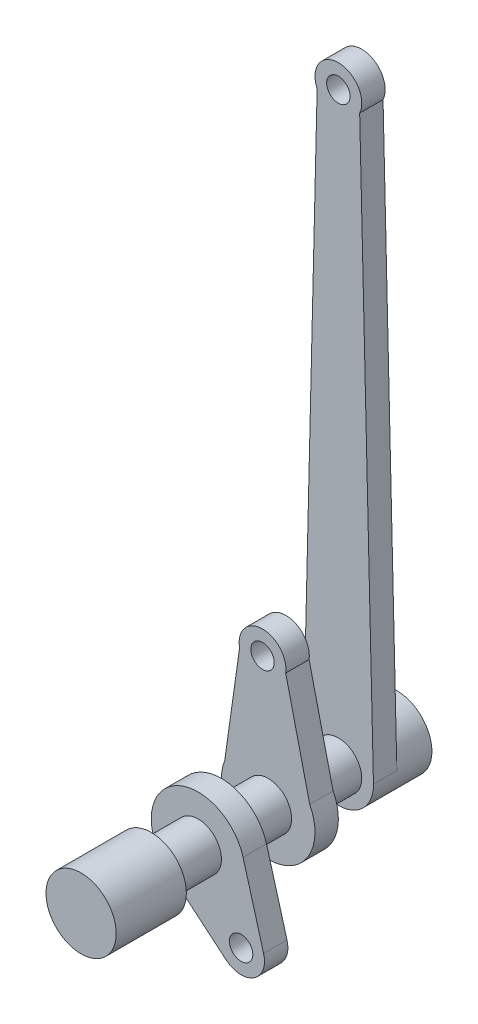
ISO-10303-21;
HEADER;
FILE_DESCRIPTION(('STEP AP214'),'2;1');
FILE_NAME('part.step','',(''),(''),'','','');
FILE_SCHEMA(('AUTOMOTIVE_DESIGN { 1 0 10303 214 1 1 1 1 }'));
ENDSEC;
DATA;
#1=APPLICATION_CONTEXT('core data for automotive mechanical design processes');
#2=APPLICATION_PROTOCOL_DEFINITION('international standard','automotive_design',2000,#1);
#3=PRODUCT_CONTEXT('',#1,'mechanical');
#4=PRODUCT('Part','Part','',(#3));
#5=PRODUCT_RELATED_PRODUCT_CATEGORY('part','',(#4));
#6=PRODUCT_DEFINITION_FORMATION('','',#4);
#7=PRODUCT_DEFINITION_CONTEXT('part definition',#1,'design');
#8=PRODUCT_DEFINITION('design','',#6,#7);
#9=PRODUCT_DEFINITION_SHAPE('','',#8);
#10=(LENGTH_UNIT() NAMED_UNIT(*) SI_UNIT(.MILLI.,.METRE.));
#11=(NAMED_UNIT(*) PLANE_ANGLE_UNIT() SI_UNIT($,.RADIAN.));
#12=(NAMED_UNIT(*) SI_UNIT($,.STERADIAN.) SOLID_ANGLE_UNIT());
#13=UNCERTAINTY_MEASURE_WITH_UNIT(LENGTH_MEASURE(1.E-05),#10,'distance_accuracy_value','');
#14=(GEOMETRIC_REPRESENTATION_CONTEXT(3) GLOBAL_UNCERTAINTY_ASSIGNED_CONTEXT((#13)) GLOBAL_UNIT_ASSIGNED_CONTEXT((#10,
#11,#12)) REPRESENTATION_CONTEXT('',''));
#15=CARTESIAN_POINT('',(0.,0.,0.));
#16=DIRECTION('',(0.,0.,1.));
#17=DIRECTION('',(1.,0.,0.));
#18=AXIS2_PLACEMENT_3D('',#15,#16,#17);
#19=CARTESIAN_POINT('',(0.,0.,15.));
#20=DIRECTION('',(0.,0.,-1.));
#21=DIRECTION('',(-1.,0.,0.));
#22=AXIS2_PLACEMENT_3D('',#19,#20,#21);
#23=CYLINDRICAL_SURFACE('',#22,15.);
#24=CARTESIAN_POINT('',(0.,0.,15.));
#25=DIRECTION('',(0.,0.,1.));
#26=DIRECTION('',(1.,0.,0.));
#27=AXIS2_PLACEMENT_3D('',#24,#25,#26);
#28=CIRCLE('',#27,15.);
#29=CARTESIAN_POINT('',(14.9956840142613,0.359806815425809,15.));
#30=VERTEX_POINT('',#29);
#31=CARTESIAN_POINT('',(-14.9956431706852,0.361505044893681,15.));
#32=VERTEX_POINT('',#31);
#33=EDGE_CURVE('E11',#30,#32,#28,.T.);
#34=ORIENTED_EDGE('',*,*,#33,.F.);
#35=DIRECTION('',(0.,0.,-1.));
#36=VECTOR('',#35,1.);
#37=CARTESIAN_POINT('',(14.9956840142613,0.359806815425809,25.));
#38=LINE('',#37,#36);
#39=CARTESIAN_POINT('',(14.9956840142613,0.359806815425809,25.));
#40=VERTEX_POINT('',#39);
#41=EDGE_CURVE('E268',#40,#30,#38,.T.);
#42=ORIENTED_EDGE('',*,*,#41,.F.);
#43=CARTESIAN_POINT('',(0.,0.,25.));
#44=DIRECTION('',(0.,0.,1.));
#45=DIRECTION('',(1.,0.,0.));
#46=AXIS2_PLACEMENT_3D('',#43,#44,#45);
#47=CIRCLE('',#46,15.);
#48=CARTESIAN_POINT('',(-14.9956431706852,0.361505044893684,25.));
#49=VERTEX_POINT('',#48);
#50=EDGE_CURVE('E252',#49,#40,#47,.T.);
#51=ORIENTED_EDGE('',*,*,#50,.F.);
#52=DIRECTION('',(0.,0.,-1.));
#53=VECTOR('',#52,1.);
#54=CARTESIAN_POINT('',(-14.9956431706852,0.361505044893684,25.));
#55=LINE('',#54,#53);
#56=EDGE_CURVE('E271',#49,#32,#55,.T.);
#57=ORIENTED_EDGE('',*,*,#56,.T.);
#58=EDGE_LOOP('',(#34,#42,#51,#57));
#59=FACE_BOUND('',#58,.T.);
#60=CARTESIAN_POINT('',(0.,0.,0.));
#61=DIRECTION('',(0.,0.,1.));
#62=DIRECTION('',(1.,0.,0.));
#63=AXIS2_PLACEMENT_3D('',#60,#61,#62);
#64=CIRCLE('',#63,15.);
#65=CARTESIAN_POINT('',(15.,0.,0.));
#66=VERTEX_POINT('',#65);
#67=EDGE_CURVE('E52',#66,#66,#64,.T.);
#68=ORIENTED_EDGE('',*,*,#67,.T.);
#69=EDGE_LOOP('',(#68));
#70=FACE_BOUND('',#69,.T.);
#71=ADVANCED_FACE('F43',(#59,#70),#23,.T.);
#72=CARTESIAN_POINT('',(0.,0.,0.));
#73=DIRECTION('',(0.,0.,1.));
#74=DIRECTION('',(1.,0.,0.));
#75=AXIS2_PLACEMENT_3D('',#72,#73,#74);
#76=PLANE('',#75);
#77=ORIENTED_EDGE('',*,*,#67,.F.);
#78=EDGE_LOOP('',(#77));
#79=FACE_BOUND('',#78,.T.);
#80=ADVANCED_FACE('F282',(#79),#76,.F.);
#81=CARTESIAN_POINT('',(0.,250.,15.));
#82=DIRECTION('',(0.,0.,1.));
#83=DIRECTION('',(1.,0.,0.));
#84=AXIS2_PLACEMENT_3D('',#81,#82,#83);
#85=PLANE('',#84);
#86=CARTESIAN_POINT('',(0.,250.,15.));
#87=DIRECTION('',(0.,0.,1.));
#88=DIRECTION('',(1.,0.,0.));
#89=AXIS2_PLACEMENT_3D('',#86,#87,#88);
#90=CIRCLE('',#89,5.);
#91=CARTESIAN_POINT('',(5.,250.,15.));
#92=VERTEX_POINT('',#91);
#93=EDGE_CURVE('E234',#92,#92,#90,.T.);
#94=ORIENTED_EDGE('',*,*,#93,.T.);
#95=EDGE_LOOP('',(#94));
#96=FACE_BOUND('',#95,.T.);
#97=DIRECTION('',(-0.0239871210283873,0.999712267617423,0.));
#98=VECTOR('',#97,1.);
#99=CARTESIAN_POINT('',(9.10502704631552,245.864968865188,15.));
#100=LINE('',#99,#98);
#101=CARTESIAN_POINT('',(9.10502704631552,245.864968865188,15.));
#102=VERTEX_POINT('',#101);
#103=EDGE_CURVE('E82',#30,#102,#100,.T.);
#104=ORIENTED_EDGE('',*,*,#103,.F.);
#105=ORIENTED_EDGE('',*,*,#33,.T.);
#106=DIRECTION('',(-0.0241003363262454,-0.999709544712344,0.));
#107=VECTOR('',#106,1.);
#108=CARTESIAN_POINT('',(-9.07859919746345,245.807263827545,15.));
#109=LINE('',#108,#107);
#110=CARTESIAN_POINT('',(-9.07859919746345,245.807263827545,15.));
#111=VERTEX_POINT('',#110);
#112=EDGE_CURVE('E261',#111,#32,#109,.T.);
#113=ORIENTED_EDGE('',*,*,#112,.F.);
#114=CARTESIAN_POINT('',(0.,250.,15.));
#115=DIRECTION('',(0.,0.,1.));
#116=DIRECTION('',(1.,0.,0.));
#117=AXIS2_PLACEMENT_3D('',#114,#115,#116);
#118=CIRCLE('',#117,10.);
#119=EDGE_CURVE('E243',#102,#111,#118,.T.);
#120=ORIENTED_EDGE('',*,*,#119,.F.);
#121=EDGE_LOOP('',(#104,#105,#113,#120));
#122=FACE_BOUND('',#121,.T.);
#123=ADVANCED_FACE('F284',(#96,#122),#85,.F.);
#124=CARTESIAN_POINT('',(0.,250.,25.));
#125=DIRECTION('',(0.,0.,-1.));
#126=DIRECTION('',(-1.,0.,0.));
#127=AXIS2_PLACEMENT_3D('',#124,#125,#126);
#128=CYLINDRICAL_SURFACE('',#127,10.);
#129=ORIENTED_EDGE('',*,*,#119,.T.);
#130=DIRECTION('',(0.,0.,-1.));
#131=VECTOR('',#130,1.);
#132=CARTESIAN_POINT('',(-9.07859919746345,245.807263827545,25.));
#133=LINE('',#132,#131);
#134=CARTESIAN_POINT('',(-9.07859919746345,245.807263827545,25.));
#135=VERTEX_POINT('',#134);
#136=EDGE_CURVE('E275',#135,#111,#133,.T.);
#137=ORIENTED_EDGE('',*,*,#136,.F.);
#138=CARTESIAN_POINT('',(0.,250.,25.));
#139=DIRECTION('',(0.,0.,1.));
#140=DIRECTION('',(1.,0.,0.));
#141=AXIS2_PLACEMENT_3D('',#138,#139,#140);
#142=CIRCLE('',#141,10.);
#143=CARTESIAN_POINT('',(9.10502704631552,245.864968865188,25.));
#144=VERTEX_POINT('',#143);
#145=EDGE_CURVE('E247',#144,#135,#142,.T.);
#146=ORIENTED_EDGE('',*,*,#145,.F.);
#147=DIRECTION('',(0.,0.,-1.));
#148=VECTOR('',#147,1.);
#149=CARTESIAN_POINT('',(9.10502704631552,245.864968865188,25.));
#150=LINE('',#149,#148);
#151=EDGE_CURVE('E257',#144,#102,#150,.T.);
#152=ORIENTED_EDGE('',*,*,#151,.T.);
#153=EDGE_LOOP('',(#129,#137,#146,#152));
#154=FACE_BOUND('',#153,.T.);
#155=ADVANCED_FACE('F289',(#154),#128,.T.);
#156=CARTESIAN_POINT('',(-9.07859919746345,245.807263827545,25.));
#157=DIRECTION('',(0.999709544712344,-0.0241003363262454,0.));
#158=DIRECTION('',(0.0241003363262454,0.999709544712344,0.));
#159=AXIS2_PLACEMENT_3D('',#156,#157,#158);
#160=PLANE('',#159);
#161=ORIENTED_EDGE('',*,*,#112,.T.);
#162=ORIENTED_EDGE('',*,*,#56,.F.);
#163=DIRECTION('',(-0.0241003363262454,-0.999709544712344,0.));
#164=VECTOR('',#163,1.);
#165=CARTESIAN_POINT('',(-9.07859919746345,245.807263827545,25.));
#166=LINE('',#165,#164);
#167=EDGE_CURVE('E90',#135,#49,#166,.T.);
#168=ORIENTED_EDGE('',*,*,#167,.F.);
#169=ORIENTED_EDGE('',*,*,#136,.T.);
#170=EDGE_LOOP('',(#161,#162,#168,#169));
#171=FACE_BOUND('',#170,.T.);
#172=ADVANCED_FACE('F296',(#171),#160,.F.);
#173=CARTESIAN_POINT('',(9.10502704631552,245.864968865188,25.));
#174=DIRECTION('',(-0.999712267617423,-0.0239871210283873,0.));
#175=DIRECTION('',(0.0239871210283873,-0.999712267617423,0.));
#176=AXIS2_PLACEMENT_3D('',#173,#174,#175);
#177=PLANE('',#176);
#178=ORIENTED_EDGE('',*,*,#103,.T.);
#179=ORIENTED_EDGE('',*,*,#151,.F.);
#180=DIRECTION('',(-0.0239871210283873,0.999712267617423,0.));
#181=VECTOR('',#180,1.);
#182=CARTESIAN_POINT('',(9.10502704631552,245.864968865188,25.));
#183=LINE('',#182,#181);
#184=EDGE_CURVE('E67',#40,#144,#183,.T.);
#185=ORIENTED_EDGE('',*,*,#184,.F.);
#186=ORIENTED_EDGE('',*,*,#41,.T.);
#187=EDGE_LOOP('',(#178,#179,#185,#186));
#188=FACE_BOUND('',#187,.T.);
#189=ADVANCED_FACE('F300',(#188),#177,.F.);
#190=CARTESIAN_POINT('',(0.,250.,25.));
#191=DIRECTION('',(0.,0.,1.));
#192=DIRECTION('',(1.,0.,0.));
#193=AXIS2_PLACEMENT_3D('',#190,#191,#192);
#194=PLANE('',#193);
#195=CARTESIAN_POINT('',(0.,250.,25.));
#196=DIRECTION('',(0.,0.,1.));
#197=DIRECTION('',(1.,0.,0.));
#198=AXIS2_PLACEMENT_3D('',#195,#196,#197);
#199=CIRCLE('',#198,5.);
#200=CARTESIAN_POINT('',(5.,250.,25.));
#201=VERTEX_POINT('',#200);
#202=EDGE_CURVE('E46',#201,#201,#199,.T.);
#203=ORIENTED_EDGE('',*,*,#202,.F.);
#204=EDGE_LOOP('',(#203));
#205=FACE_BOUND('',#204,.T.);
#206=CARTESIAN_POINT('',(0.,0.,25.));
#207=DIRECTION('',(0.,0.,1.));
#208=DIRECTION('',(1.,0.,0.));
#209=AXIS2_PLACEMENT_3D('',#206,#207,#208);
#210=CIRCLE('',#209,10.);
#211=CARTESIAN_POINT('',(10.,0.,25.));
#212=VERTEX_POINT('',#211);
#213=EDGE_CURVE('E238',#212,#212,#210,.T.);
#214=ORIENTED_EDGE('',*,*,#213,.F.);
#215=EDGE_LOOP('',(#214));
#216=FACE_BOUND('',#215,.T.);
#217=ORIENTED_EDGE('',*,*,#145,.T.);
#218=ORIENTED_EDGE('',*,*,#167,.T.);
#219=ORIENTED_EDGE('',*,*,#50,.T.);
#220=ORIENTED_EDGE('',*,*,#184,.T.);
#221=EDGE_LOOP('',(#217,#218,#219,#220));
#222=FACE_BOUND('',#221,.T.);
#223=ADVANCED_FACE('F302',(#205,#216,#222),#194,.T.);
#224=CARTESIAN_POINT('',(0.,0.,45.));
#225=DIRECTION('',(0.,0.,-1.));
#226=DIRECTION('',(-1.,0.,0.));
#227=AXIS2_PLACEMENT_3D('',#224,#225,#226);
#228=CYLINDRICAL_SURFACE('',#227,10.);
#229=CARTESIAN_POINT('',(0.,0.,45.));
#230=DIRECTION('',(0.,0.,1.));
#231=DIRECTION('',(1.,0.,0.));
#232=AXIS2_PLACEMENT_3D('',#229,#230,#231);
#233=CIRCLE('',#232,10.);
#234=CARTESIAN_POINT('',(10.,0.,45.));
#235=VERTEX_POINT('',#234);
#236=EDGE_CURVE('E239',#235,#235,#233,.T.);
#237=ORIENTED_EDGE('',*,*,#236,.F.);
#238=EDGE_LOOP('',(#237));
#239=FACE_BOUND('',#238,.T.);
#240=ORIENTED_EDGE('',*,*,#213,.T.);
#241=EDGE_LOOP('',(#240));
#242=FACE_BOUND('',#241,.T.);
#243=ADVANCED_FACE('F306',(#239,#242),#228,.T.);
#244=CARTESIAN_POINT('',(0.,250.,0.));
#245=DIRECTION('',(0.,0.,1.));
#246=DIRECTION('',(1.,0.,0.));
#247=AXIS2_PLACEMENT_3D('',#244,#245,#246);
#248=CYLINDRICAL_SURFACE('',#247,5.);
#249=ORIENTED_EDGE('',*,*,#202,.T.);
#250=EDGE_LOOP('',(#249));
#251=FACE_BOUND('',#250,.T.);
#252=ORIENTED_EDGE('',*,*,#93,.F.);
#253=EDGE_LOOP('',(#252));
#254=FACE_BOUND('',#253,.T.);
#255=ADVANCED_FACE('F310',(#251,#254),#248,.F.);
#256=CARTESIAN_POINT('',(-2.41998026338694,54.1259281262208,55.));
#257=DIRECTION('',(0.,0.,-1.));
#258=DIRECTION('',(-1.,0.,0.));
#259=AXIS2_PLACEMENT_3D('',#256,#257,#258);
#260=CYLINDRICAL_SURFACE('',#259,10.);
#261=CARTESIAN_POINT('',(-2.41998026338694,54.1259281262208,45.));
#262=DIRECTION('',(0.,0.,1.));
#263=DIRECTION('',(1.,0.,0.));
#264=AXIS2_PLACEMENT_3D('',#261,#262,#263);
#265=CIRCLE('',#264,10.);
#266=CARTESIAN_POINT('',(7.48238877438495,52.7319814128287,45.));
#267=VERTEX_POINT('',#266);
#268=CARTESIAN_POINT('',(-12.2347082367577,52.2099127795355,45.));
#269=VERTEX_POINT('',#268);
#270=EDGE_CURVE('E192',#267,#269,#265,.T.);
#271=ORIENTED_EDGE('',*,*,#270,.T.);
#272=DIRECTION('',(0.,0.,-1.));
#273=VECTOR('',#272,1.);
#274=CARTESIAN_POINT('',(-12.2347082367577,52.2099127795355,55.));
#275=LINE('',#274,#273);
#276=CARTESIAN_POINT('',(-12.2347082367577,52.2099127795355,55.));
#277=VERTEX_POINT('',#276);
#278=EDGE_CURVE('E230',#277,#269,#275,.T.);
#279=ORIENTED_EDGE('',*,*,#278,.F.);
#280=CARTESIAN_POINT('',(-2.41998026338694,54.1259281262208,55.));
#281=DIRECTION('',(0.,0.,1.));
#282=DIRECTION('',(1.,0.,0.));
#283=AXIS2_PLACEMENT_3D('',#280,#281,#282);
#284=CIRCLE('',#283,10.);
#285=CARTESIAN_POINT('',(7.48238877438495,52.7319814128287,55.));
#286=VERTEX_POINT('',#285);
#287=EDGE_CURVE('E193',#286,#277,#284,.T.);
#288=ORIENTED_EDGE('',*,*,#287,.F.);
#289=DIRECTION('',(0.,0.,-1.));
#290=VECTOR('',#289,1.);
#291=CARTESIAN_POINT('',(7.48238877438495,52.7319814128287,55.));
#292=LINE('',#291,#290);
#293=EDGE_CURVE('E207',#286,#267,#292,.T.);
#294=ORIENTED_EDGE('',*,*,#293,.T.);
#295=EDGE_LOOP('',(#271,#279,#288,#294));
#296=FACE_BOUND('',#295,.T.);
#297=ADVANCED_FACE('F314',(#296),#260,.T.);
#298=CARTESIAN_POINT('',(-12.2347082367577,52.2099127795355,55.));
#299=DIRECTION('',(0.990118052329444,-0.140236380626957,0.));
#300=DIRECTION('',(0.140236380626957,0.990118052329444,0.));
#301=AXIS2_PLACEMENT_3D('',#298,#299,#300);
#302=PLANE('',#301);
#303=DIRECTION('',(-0.140236380626957,-0.990118052329444,0.));
#304=VECTOR('',#303,1.);
#305=CARTESIAN_POINT('',(-12.2347082367577,52.2099127795355,45.));
#306=LINE('',#305,#304);
#307=CARTESIAN_POINT('',(-18.5818315662944,7.39699504135726,45.));
#308=VERTEX_POINT('',#307);
#309=EDGE_CURVE('E211',#269,#308,#306,.T.);
#310=ORIENTED_EDGE('',*,*,#309,.T.);
#311=DIRECTION('',(0.,0.,-1.));
#312=VECTOR('',#311,1.);
#313=CARTESIAN_POINT('',(-18.5818315662944,7.39699504135726,55.));
#314=LINE('',#313,#312);
#315=CARTESIAN_POINT('',(-18.5818315662944,7.39699504135726,55.));
#316=VERTEX_POINT('',#315);
#317=EDGE_CURVE('E226',#316,#308,#314,.T.);
#318=ORIENTED_EDGE('',*,*,#317,.F.);
#319=DIRECTION('',(-0.140236380626957,-0.990118052329444,0.));
#320=VECTOR('',#319,1.);
#321=CARTESIAN_POINT('',(-12.2347082367577,52.2099127795355,55.));
#322=LINE('',#321,#320);
#323=EDGE_CURVE('E197',#277,#316,#322,.T.);
#324=ORIENTED_EDGE('',*,*,#323,.F.);
#325=ORIENTED_EDGE('',*,*,#278,.T.);
#326=EDGE_LOOP('',(#310,#318,#324,#325));
#327=FACE_BOUND('',#326,.T.);
#328=ADVANCED_FACE('F318',(#327),#302,.F.);
#329=CARTESIAN_POINT('',(0.,0.,55.));
#330=DIRECTION('',(0.,0.,-1.));
#331=DIRECTION('',(-1.,0.,0.));
#332=AXIS2_PLACEMENT_3D('',#329,#330,#331);
#333=CYLINDRICAL_SURFACE('',#332,20.);
#334=CARTESIAN_POINT('',(0.,0.,45.));
#335=DIRECTION('',(0.,0.,1.));
#336=DIRECTION('',(1.,0.,0.));
#337=AXIS2_PLACEMENT_3D('',#334,#335,#336);
#338=CIRCLE('',#337,20.);
#339=CARTESIAN_POINT('',(17.7497064610404,9.21671961963152,45.));
#340=VERTEX_POINT('',#339);
#341=EDGE_CURVE('E214',#308,#340,#338,.T.);
#342=ORIENTED_EDGE('',*,*,#341,.T.);
#343=DIRECTION('',(0.,0.,-1.));
#344=VECTOR('',#343,1.);
#345=CARTESIAN_POINT('',(17.7497064610404,9.21671961963152,55.));
#346=LINE('',#345,#344);
#347=CARTESIAN_POINT('',(17.7497064610404,9.21671961963152,55.));
#348=VERTEX_POINT('',#347);
#349=EDGE_CURVE('E222',#348,#340,#346,.T.);
#350=ORIENTED_EDGE('',*,*,#349,.F.);
#351=CARTESIAN_POINT('',(0.,0.,55.));
#352=DIRECTION('',(0.,0.,1.));
#353=DIRECTION('',(1.,0.,0.));
#354=AXIS2_PLACEMENT_3D('',#351,#352,#353);
#355=CIRCLE('',#354,20.);
#356=EDGE_CURVE('E201',#316,#348,#355,.T.);
#357=ORIENTED_EDGE('',*,*,#356,.F.);
#358=ORIENTED_EDGE('',*,*,#317,.T.);
#359=EDGE_LOOP('',(#342,#350,#357,#358));
#360=FACE_BOUND('',#359,.T.);
#361=ADVANCED_FACE('F322',(#360),#333,.T.);
#362=CARTESIAN_POINT('',(7.48238877438495,52.7319814128287,55.));
#363=DIRECTION('',(-0.973275200489972,-0.229641860537676,0.));
#364=DIRECTION('',(0.229641860537676,-0.973275200489972,0.));
#365=AXIS2_PLACEMENT_3D('',#362,#363,#364);
#366=PLANE('',#365);
#367=DIRECTION('',(-0.229641860537676,0.973275200489972,0.));
#368=VECTOR('',#367,1.);
#369=CARTESIAN_POINT('',(7.48238877438495,52.7319814128287,45.));
#370=LINE('',#369,#368);
#371=EDGE_CURVE('E198',#340,#267,#370,.T.);
#372=ORIENTED_EDGE('',*,*,#371,.T.);
#373=ORIENTED_EDGE('',*,*,#293,.F.);
#374=DIRECTION('',(-0.229641860537676,0.973275200489972,0.));
#375=VECTOR('',#374,1.);
#376=CARTESIAN_POINT('',(7.48238877438495,52.7319814128287,55.));
#377=LINE('',#376,#375);
#378=EDGE_CURVE('E204',#348,#286,#377,.T.);
#379=ORIENTED_EDGE('',*,*,#378,.F.);
#380=ORIENTED_EDGE('',*,*,#349,.T.);
#381=EDGE_LOOP('',(#372,#373,#379,#380));
#382=FACE_BOUND('',#381,.T.);
#383=ADVANCED_FACE('F326',(#382),#366,.F.);
#384=CARTESIAN_POINT('',(-2.41998026338694,54.1259281262208,55.));
#385=DIRECTION('',(0.,0.,1.));
#386=DIRECTION('',(1.,0.,0.));
#387=AXIS2_PLACEMENT_3D('',#384,#385,#386);
#388=PLANE('',#387);
#389=CARTESIAN_POINT('',(0.,0.,55.));
#390=DIRECTION('',(0.,0.,1.));
#391=DIRECTION('',(1.,0.,0.));
#392=AXIS2_PLACEMENT_3D('',#389,#390,#391);
#393=CIRCLE('',#392,10.);
#394=CARTESIAN_POINT('',(10.,0.,55.));
#395=VERTEX_POINT('',#394);
#396=EDGE_CURVE('E170',#395,#395,#393,.T.);
#397=ORIENTED_EDGE('',*,*,#396,.F.);
#398=EDGE_LOOP('',(#397));
#399=FACE_BOUND('',#398,.T.);
#400=CARTESIAN_POINT('',(-2.41998026338694,54.1259281262208,55.));
#401=DIRECTION('',(0.,0.,1.));
#402=DIRECTION('',(1.,0.,0.));
#403=AXIS2_PLACEMENT_3D('',#400,#401,#402);
#404=CIRCLE('',#403,5.);
#405=CARTESIAN_POINT('',(-7.41998026338694,54.1259281262208,55.));
#406=VERTEX_POINT('',#405);
#407=EDGE_CURVE('E188',#406,#406,#404,.F.);
#408=ORIENTED_EDGE('',*,*,#407,.T.);
#409=EDGE_LOOP('',(#408));
#410=FACE_BOUND('',#409,.T.);
#411=ORIENTED_EDGE('',*,*,#287,.T.);
#412=ORIENTED_EDGE('',*,*,#323,.T.);
#413=ORIENTED_EDGE('',*,*,#356,.T.);
#414=ORIENTED_EDGE('',*,*,#378,.T.);
#415=EDGE_LOOP('',(#411,#412,#413,#414));
#416=FACE_BOUND('',#415,.T.);
#417=ADVANCED_FACE('F330',(#399,#410,#416),#388,.T.);
#418=CARTESIAN_POINT('',(-2.41998026338694,54.1259281262208,45.));
#419=DIRECTION('',(0.,0.,1.));
#420=DIRECTION('',(1.,0.,0.));
#421=AXIS2_PLACEMENT_3D('',#418,#419,#420);
#422=PLANE('',#421);
#423=CARTESIAN_POINT('',(-2.41998026338694,54.1259281262208,45.));
#424=DIRECTION('',(0.,0.,1.));
#425=DIRECTION('',(1.,0.,0.));
#426=AXIS2_PLACEMENT_3D('',#423,#424,#425);
#427=CIRCLE('',#426,5.);
#428=CARTESIAN_POINT('',(-7.41998026338694,54.1259281262208,45.));
#429=VERTEX_POINT('',#428);
#430=EDGE_CURVE('E183',#429,#429,#427,.T.);
#431=ORIENTED_EDGE('',*,*,#430,.T.);
#432=EDGE_LOOP('',(#431));
#433=FACE_BOUND('',#432,.T.);
#434=ORIENTED_EDGE('',*,*,#236,.T.);
#435=EDGE_LOOP('',(#434));
#436=FACE_BOUND('',#435,.T.);
#437=ORIENTED_EDGE('',*,*,#270,.F.);
#438=ORIENTED_EDGE('',*,*,#371,.F.);
#439=ORIENTED_EDGE('',*,*,#341,.F.);
#440=ORIENTED_EDGE('',*,*,#309,.F.);
#441=EDGE_LOOP('',(#437,#438,#439,#440));
#442=FACE_BOUND('',#441,.T.);
#443=ADVANCED_FACE('F332',(#433,#436,#442),#422,.F.);
#444=CARTESIAN_POINT('',(-2.41998026338694,54.1259281262208,55.000012));
#445=DIRECTION('',(0.,0.,-1.));
#446=DIRECTION('',(-1.,0.,0.));
#447=AXIS2_PLACEMENT_3D('',#444,#445,#446);
#448=CYLINDRICAL_SURFACE('',#447,5.);
#449=CARTESIAN_POINT('',(-7.41998026338694,54.1259281262208,55.));
#450=CARTESIAN_POINT('',(-7.41998026338694,54.1259281262208,54.8958333333333));
#451=CARTESIAN_POINT('',(-7.41998026338694,54.1259281262208,54.7916666666667));
#452=CARTESIAN_POINT('',(-7.41998026338694,54.1259281262208,54.5833333333333));
#453=CARTESIAN_POINT('',(-7.41998026338694,54.1259281262208,54.4791666666667));
#454=CARTESIAN_POINT('',(-7.41998026338694,54.1259281262208,54.2708333333333));
#455=CARTESIAN_POINT('',(-7.41998026338694,54.1259281262208,54.1666666666667));
#456=CARTESIAN_POINT('',(-7.41998026338694,54.1259281262208,53.9583333333333));
#457=CARTESIAN_POINT('',(-7.41998026338694,54.1259281262208,53.8541666666667));
#458=CARTESIAN_POINT('',(-7.41998026338694,54.1259281262208,53.6458333333333));
#459=CARTESIAN_POINT('',(-7.41998026338694,54.1259281262208,53.5416666666667));
#460=CARTESIAN_POINT('',(-7.41998026338694,54.1259281262208,53.3333333333333));
#461=CARTESIAN_POINT('',(-7.41998026338694,54.1259281262208,53.2291666666667));
#462=CARTESIAN_POINT('',(-7.41998026338694,54.1259281262208,53.0208333333333));
#463=CARTESIAN_POINT('',(-7.41998026338694,54.1259281262208,52.9166666666667));
#464=CARTESIAN_POINT('',(-7.41998026338694,54.1259281262208,52.7083333333333));
#465=CARTESIAN_POINT('',(-7.41998026338694,54.1259281262208,52.6041666666667));
#466=CARTESIAN_POINT('',(-7.41998026338694,54.1259281262208,52.3958333333333));
#467=CARTESIAN_POINT('',(-7.41998026338694,54.1259281262208,52.2916666666667));
#468=CARTESIAN_POINT('',(-7.41998026338694,54.1259281262208,52.0833333333333));
#469=CARTESIAN_POINT('',(-7.41998026338694,54.1259281262208,51.9791666666667));
#470=CARTESIAN_POINT('',(-7.41998026338694,54.1259281262208,51.7708333333333));
#471=CARTESIAN_POINT('',(-7.41998026338694,54.1259281262208,51.6666666666667));
#472=CARTESIAN_POINT('',(-7.41998026338694,54.1259281262208,51.4583333333333));
#473=CARTESIAN_POINT('',(-7.41998026338694,54.1259281262208,51.3541666666667));
#474=CARTESIAN_POINT('',(-7.41998026338694,54.1259281262208,51.1458333333333));
#475=CARTESIAN_POINT('',(-7.41998026338694,54.1259281262208,51.0416666666667));
#476=CARTESIAN_POINT('',(-7.41998026338694,54.1259281262208,50.8333333333333));
#477=CARTESIAN_POINT('',(-7.41998026338694,54.1259281262208,50.7291666666667));
#478=CARTESIAN_POINT('',(-7.41998026338694,54.1259281262208,50.5208333333333));
#479=CARTESIAN_POINT('',(-7.41998026338694,54.1259281262208,50.4166666666667));
#480=CARTESIAN_POINT('',(-7.41998026338694,54.1259281262208,50.2083333333333));
#481=CARTESIAN_POINT('',(-7.41998026338694,54.1259281262208,50.1041666666667));
#482=CARTESIAN_POINT('',(-7.41998026338694,54.1259281262208,49.8958333333333));
#483=CARTESIAN_POINT('',(-7.41998026338694,54.1259281262208,49.7916666666667));
#484=CARTESIAN_POINT('',(-7.41998026338694,54.1259281262208,49.5833333333333));
#485=CARTESIAN_POINT('',(-7.41998026338694,54.1259281262208,49.4791666666667));
#486=CARTESIAN_POINT('',(-7.41998026338694,54.1259281262208,49.2708333333333));
#487=CARTESIAN_POINT('',(-7.41998026338694,54.1259281262208,49.1666666666667));
#488=CARTESIAN_POINT('',(-7.41998026338694,54.1259281262208,48.9583333333333));
#489=CARTESIAN_POINT('',(-7.41998026338694,54.1259281262208,48.8541666666667));
#490=CARTESIAN_POINT('',(-7.41998026338694,54.1259281262208,48.6458333333333));
#491=CARTESIAN_POINT('',(-7.41998026338694,54.1259281262208,48.5416666666667));
#492=CARTESIAN_POINT('',(-7.41998026338694,54.1259281262208,48.3333333333333));
#493=CARTESIAN_POINT('',(-7.41998026338694,54.1259281262208,48.2291666666667));
#494=CARTESIAN_POINT('',(-7.41998026338694,54.1259281262208,48.0208333333333));
#495=CARTESIAN_POINT('',(-7.41998026338694,54.1259281262208,47.9166666666667));
#496=CARTESIAN_POINT('',(-7.41998026338694,54.1259281262208,47.7083333333333));
#497=CARTESIAN_POINT('',(-7.41998026338694,54.1259281262208,47.6041666666667));
#498=CARTESIAN_POINT('',(-7.41998026338694,54.1259281262208,47.3958333333333));
#499=CARTESIAN_POINT('',(-7.41998026338694,54.1259281262208,47.2916666666667));
#500=CARTESIAN_POINT('',(-7.41998026338694,54.1259281262208,47.0833333333333));
#501=CARTESIAN_POINT('',(-7.41998026338694,54.1259281262208,46.9791666666667));
#502=CARTESIAN_POINT('',(-7.41998026338694,54.1259281262208,46.7708333333333));
#503=CARTESIAN_POINT('',(-7.41998026338694,54.1259281262208,46.6666666666667));
#504=CARTESIAN_POINT('',(-7.41998026338694,54.1259281262208,46.4583333333333));
#505=CARTESIAN_POINT('',(-7.41998026338694,54.1259281262208,46.3541666666667));
#506=CARTESIAN_POINT('',(-7.41998026338694,54.1259281262208,46.1458333333333));
#507=CARTESIAN_POINT('',(-7.41998026338694,54.1259281262208,46.0416666666667));
#508=CARTESIAN_POINT('',(-7.41998026338694,54.1259281262208,45.8333333333333));
#509=CARTESIAN_POINT('',(-7.41998026338694,54.1259281262208,45.7291666666667));
#510=CARTESIAN_POINT('',(-7.41998026338694,54.1259281262208,45.5208333333333));
#511=CARTESIAN_POINT('',(-7.41998026338694,54.1259281262208,45.4166666666667));
#512=CARTESIAN_POINT('',(-7.41998026338694,54.1259281262208,45.2083333333333));
#513=CARTESIAN_POINT('',(-7.41998026338694,54.1259281262208,45.1041666666667));
#514=CARTESIAN_POINT('',(-7.41998026338694,54.1259281262208,45.));
#515=B_SPLINE_CURVE_WITH_KNOTS('',3,(#449,#450,#451,#452,#453,#454,#455,#456,#457,#458,#459,
#460,#461,#462,#463,#464,#465,#466,#467,#468,#469,#470,#471,#472,#473,#474,#475,#476,#477,#478,
#479,#480,#481,#482,#483,#484,#485,#486,#487,#488,#489,#490,#491,#492,#493,#494,#495,#496,#497,
#498,#499,#500,#501,#502,#503,#504,#505,#506,#507,#508,#509,#510,#511,#512,#513,#514),
.UNSPECIFIED.,.F.,.F.,(4,2,2,2,2,2,2,2,2,2,2,2,2,2,2,2,2,2,2,2,2,2,2,2,2,2,2,2,2,2,2,2,4),(0.,
0.3125,0.625000000000001,0.937500000000001,1.25,1.5625,1.875,2.1875,2.5,2.8125,3.125,3.4375,
3.75,4.0625,4.375,4.6875,5.,5.3125,5.62500000000001,5.93750000000001,6.25000000000001,
6.56250000000001,6.87500000000001,7.18750000000001,7.50000000000001,7.81250000000001,
8.12500000000001,8.43750000000001,8.75000000000001,9.06250000000001,9.37500000000001,
9.68750000000001,10.),.UNSPECIFIED.);
#516=EDGE_CURVE('BSEAM335',#406,#429,#515,.T.);
#517=ORIENTED_EDGE('',*,*,#407,.F.);
#518=ORIENTED_EDGE('',*,*,#430,.F.);
#519=ORIENTED_EDGE('',*,*,#516,.T.);
#520=ORIENTED_EDGE('',*,*,#516,.F.);
#521=EDGE_LOOP('',(#517,#519,#518,#520));
#522=FACE_BOUND('',#521,.T.);
#523=ADVANCED_FACE('F335',(#522),#448,.F.);
#524=CARTESIAN_POINT('',(0.,0.,75.));
#525=DIRECTION('',(0.,0.,-1.));
#526=DIRECTION('',(-1.,0.,0.));
#527=AXIS2_PLACEMENT_3D('',#524,#525,#526);
#528=CYLINDRICAL_SURFACE('',#527,10.);
#529=CARTESIAN_POINT('',(0.,0.,75.));
#530=DIRECTION('',(0.,0.,1.));
#531=DIRECTION('',(1.,0.,0.));
#532=AXIS2_PLACEMENT_3D('',#529,#530,#531);
#533=CIRCLE('',#532,10.);
#534=CARTESIAN_POINT('',(10.,0.,75.));
#535=VERTEX_POINT('',#534);
#536=EDGE_CURVE('E175',#535,#535,#533,.T.);
#537=ORIENTED_EDGE('',*,*,#536,.F.);
#538=EDGE_LOOP('',(#537));
#539=FACE_BOUND('',#538,.T.);
#540=ORIENTED_EDGE('',*,*,#396,.T.);
#541=EDGE_LOOP('',(#540));
#542=FACE_BOUND('',#541,.T.);
#543=ADVANCED_FACE('F342',(#539,#542),#528,.T.);
#544=CARTESIAN_POINT('',(18.4163349539881,-28.5327917817818,85.));
#545=DIRECTION('',(0.,0.,1.));
#546=DIRECTION('',(1.,0.,0.));
#547=AXIS2_PLACEMENT_3D('',#544,#545,#546);
#548=PLANE('',#547);
#549=CARTESIAN_POINT('',(0.,0.,85.));
#550=DIRECTION('',(0.,0.,1.));
#551=DIRECTION('',(1.,0.,0.));
#552=AXIS2_PLACEMENT_3D('',#549,#550,#551);
#553=CIRCLE('',#552,10.);
#554=CARTESIAN_POINT('',(10.,0.,85.));
#555=VERTEX_POINT('',#554);
#556=EDGE_CURVE('E391',#555,#555,#553,.T.);
#557=ORIENTED_EDGE('',*,*,#556,.F.);
#558=EDGE_LOOP('',(#557));
#559=FACE_BOUND('',#558,.T.);
#560=CARTESIAN_POINT('',(18.4163349539881,-28.5327917817818,85.));
#561=DIRECTION('',(0.,0.,1.));
#562=DIRECTION('',(1.,0.,0.));
#563=AXIS2_PLACEMENT_3D('',#560,#561,#562);
#564=CIRCLE('',#563,10.);
#565=CARTESIAN_POINT('',(11.9838345148654,-36.1893535493565,85.));
#566=VERTEX_POINT('',#565);
#567=CARTESIAN_POINT('',(28.0425627453877,-25.8243349318235,85.));
#568=VERTEX_POINT('',#567);
#569=EDGE_CURVE('E153',#566,#568,#564,.T.);
#570=ORIENTED_EDGE('',*,*,#569,.T.);
#571=DIRECTION('',(-0.270845684995839,0.962622779139957,0.));
#572=VECTOR('',#571,1.);
#573=CARTESIAN_POINT('',(28.0425627453877,-25.8243349318235,85.));
#574=LINE('',#573,#572);
#575=CARTESIAN_POINT('',(19.2524555827992,5.41691369991677,85.));
#576=VERTEX_POINT('',#575);
#577=EDGE_CURVE('E141',#568,#576,#574,.T.);
#578=ORIENTED_EDGE('',*,*,#577,.T.);
#579=CARTESIAN_POINT('',(0.,0.,85.));
#580=DIRECTION('',(0.,0.,1.));
#581=DIRECTION('',(1.,0.,0.));
#582=AXIS2_PLACEMENT_3D('',#579,#580,#581);
#583=CIRCLE('',#582,20.);
#584=CARTESIAN_POINT('',(-12.8650008782454,-15.3131235351493,85.));
#585=VERTEX_POINT('',#584);
#586=EDGE_CURVE('E152',#576,#585,#583,.T.);
#587=ORIENTED_EDGE('',*,*,#586,.T.);
#588=DIRECTION('',(0.765656176757466,-0.643250043912272,0.));
#589=VECTOR('',#588,1.);
#590=CARTESIAN_POINT('',(11.9838345148654,-36.1893535493565,85.));
#591=LINE('',#590,#589);
#592=EDGE_CURVE('E159',#585,#566,#591,.T.);
#593=ORIENTED_EDGE('',*,*,#592,.T.);
#594=EDGE_LOOP('',(#570,#578,#587,#593));
#595=FACE_BOUND('',#594,.T.);
#596=CARTESIAN_POINT('',(18.4163349539881,-28.5327917817818,85.));
#597=DIRECTION('',(0.,0.,1.));
#598=DIRECTION('',(1.,0.,0.));
#599=AXIS2_PLACEMENT_3D('',#596,#597,#598);
#600=CIRCLE('',#599,5.);
#601=CARTESIAN_POINT('',(23.4163349539881,-28.5327917817818,85.));
#602=VERTEX_POINT('',#601);
#603=EDGE_CURVE('E406',#602,#602,#600,.T.);
#604=ORIENTED_EDGE('',*,*,#603,.F.);
#605=EDGE_LOOP('',(#604));
#606=FACE_BOUND('',#605,.T.);
#607=ADVANCED_FACE('F156',(#559,#595,#606),#548,.T.);
#608=CARTESIAN_POINT('',(18.4163349539881,-28.5327917817818,75.));
#609=DIRECTION('',(0.,0.,1.));
#610=DIRECTION('',(1.,0.,0.));
#611=AXIS2_PLACEMENT_3D('',#608,#609,#610);
#612=PLANE('',#611);
#613=ORIENTED_EDGE('',*,*,#536,.T.);
#614=EDGE_LOOP('',(#613));
#615=FACE_BOUND('',#614,.T.);
#616=CARTESIAN_POINT('',(18.4163349539881,-28.5327917817818,75.));
#617=DIRECTION('',(0.,0.,1.));
#618=DIRECTION('',(1.,0.,0.));
#619=AXIS2_PLACEMENT_3D('',#616,#617,#618);
#620=CIRCLE('',#619,10.);
#621=CARTESIAN_POINT('',(11.9838345148654,-36.1893535493565,75.));
#622=VERTEX_POINT('',#621);
#623=CARTESIAN_POINT('',(28.0425627453877,-25.8243349318235,75.));
#624=VERTEX_POINT('',#623);
#625=EDGE_CURVE('E168',#622,#624,#620,.T.);
#626=ORIENTED_EDGE('',*,*,#625,.F.);
#627=DIRECTION('',(0.765656176757466,-0.643250043912272,0.));
#628=VECTOR('',#627,1.);
#629=CARTESIAN_POINT('',(11.9838345148654,-36.1893535493565,75.));
#630=LINE('',#629,#628);
#631=CARTESIAN_POINT('',(-12.8650008782454,-15.3131235351493,75.));
#632=VERTEX_POINT('',#631);
#633=EDGE_CURVE('E164',#632,#622,#630,.T.);
#634=ORIENTED_EDGE('',*,*,#633,.F.);
#635=CARTESIAN_POINT('',(0.,0.,75.));
#636=DIRECTION('',(0.,0.,1.));
#637=DIRECTION('',(1.,0.,0.));
#638=AXIS2_PLACEMENT_3D('',#635,#636,#637);
#639=CIRCLE('',#638,20.);
#640=CARTESIAN_POINT('',(19.2524555827992,5.41691369991677,75.));
#641=VERTEX_POINT('',#640);
#642=EDGE_CURVE('E423',#641,#632,#639,.T.);
#643=ORIENTED_EDGE('',*,*,#642,.F.);
#644=DIRECTION('',(-0.270845684995839,0.962622779139957,0.));
#645=VECTOR('',#644,1.);
#646=CARTESIAN_POINT('',(28.0425627453877,-25.8243349318235,75.));
#647=LINE('',#646,#645);
#648=EDGE_CURVE('E420',#624,#641,#647,.T.);
#649=ORIENTED_EDGE('',*,*,#648,.F.);
#650=EDGE_LOOP('',(#626,#634,#643,#649));
#651=FACE_BOUND('',#650,.T.);
#652=CARTESIAN_POINT('',(18.4163349539881,-28.5327917817818,75.));
#653=DIRECTION('',(0.,0.,1.));
#654=DIRECTION('',(1.,0.,0.));
#655=AXIS2_PLACEMENT_3D('',#652,#653,#654);
#656=CIRCLE('',#655,5.);
#657=CARTESIAN_POINT('',(23.4163349539881,-28.5327917817818,75.));
#658=VERTEX_POINT('',#657);
#659=EDGE_CURVE('E404',#658,#658,#656,.T.);
#660=ORIENTED_EDGE('',*,*,#659,.T.);
#661=EDGE_LOOP('',(#660));
#662=FACE_BOUND('',#661,.T.);
#663=ADVANCED_FACE('F349',(#615,#651,#662),#612,.F.);
#664=CARTESIAN_POINT('',(18.4163349539881,-28.5327917817818,85.));
#665=DIRECTION('',(0.,0.,-1.));
#666=DIRECTION('',(-1.,0.,0.));
#667=AXIS2_PLACEMENT_3D('',#664,#665,#666);
#668=CYLINDRICAL_SURFACE('',#667,10.);
#669=ORIENTED_EDGE('',*,*,#625,.T.);
#670=DIRECTION('',(0.,0.,-1.));
#671=VECTOR('',#670,1.);
#672=CARTESIAN_POINT('',(28.0425627453877,-25.8243349318235,85.));
#673=LINE('',#672,#671);
#674=EDGE_CURVE('E145',#568,#624,#673,.T.);
#675=ORIENTED_EDGE('',*,*,#674,.F.);
#676=ORIENTED_EDGE('',*,*,#569,.F.);
#677=DIRECTION('',(0.,0.,-1.));
#678=VECTOR('',#677,1.);
#679=CARTESIAN_POINT('',(11.9838345148654,-36.1893535493565,85.));
#680=LINE('',#679,#678);
#681=EDGE_CURVE('E417',#566,#622,#680,.T.);
#682=ORIENTED_EDGE('',*,*,#681,.T.);
#683=EDGE_LOOP('',(#669,#675,#676,#682));
#684=FACE_BOUND('',#683,.T.);
#685=ADVANCED_FACE('F166',(#684),#668,.T.);
#686=CARTESIAN_POINT('',(28.0425627453877,-25.8243349318235,85.));
#687=DIRECTION('',(-0.962622779139957,-0.270845684995839,0.));
#688=DIRECTION('',(0.270845684995839,-0.962622779139957,0.));
#689=AXIS2_PLACEMENT_3D('',#686,#687,#688);
#690=PLANE('',#689);
#691=ORIENTED_EDGE('',*,*,#648,.T.);
#692=DIRECTION('',(0.,0.,-1.));
#693=VECTOR('',#692,1.);
#694=CARTESIAN_POINT('',(19.2524555827992,5.41691369991677,85.));
#695=LINE('',#694,#693);
#696=EDGE_CURVE('E148',#576,#641,#695,.T.);
#697=ORIENTED_EDGE('',*,*,#696,.F.);
#698=ORIENTED_EDGE('',*,*,#577,.F.);
#699=ORIENTED_EDGE('',*,*,#674,.T.);
#700=EDGE_LOOP('',(#691,#697,#698,#699));
#701=FACE_BOUND('',#700,.T.);
#702=ADVANCED_FACE('F143',(#701),#690,.F.);
#703=CARTESIAN_POINT('',(0.,0.,85.));
#704=DIRECTION('',(0.,0.,-1.));
#705=DIRECTION('',(-1.,0.,0.));
#706=AXIS2_PLACEMENT_3D('',#703,#704,#705);
#707=CYLINDRICAL_SURFACE('',#706,20.);
#708=ORIENTED_EDGE('',*,*,#642,.T.);
#709=DIRECTION('',(0.,0.,-1.));
#710=VECTOR('',#709,1.);
#711=CARTESIAN_POINT('',(-12.8650008782454,-15.3131235351493,85.));
#712=LINE('',#711,#710);
#713=EDGE_CURVE('E177',#585,#632,#712,.T.);
#714=ORIENTED_EDGE('',*,*,#713,.F.);
#715=ORIENTED_EDGE('',*,*,#586,.F.);
#716=ORIENTED_EDGE('',*,*,#696,.T.);
#717=EDGE_LOOP('',(#708,#714,#715,#716));
#718=FACE_BOUND('',#717,.T.);
#719=ADVANCED_FACE('F352',(#718),#707,.T.);
#720=CARTESIAN_POINT('',(11.9838345148654,-36.1893535493565,85.));
#721=DIRECTION('',(0.643250043912272,0.765656176757466,0.));
#722=DIRECTION('',(-0.765656176757466,0.643250043912272,0.));
#723=AXIS2_PLACEMENT_3D('',#720,#721,#722);
#724=PLANE('',#723);
#725=ORIENTED_EDGE('',*,*,#633,.T.);
#726=ORIENTED_EDGE('',*,*,#681,.F.);
#727=ORIENTED_EDGE('',*,*,#592,.F.);
#728=ORIENTED_EDGE('',*,*,#713,.T.);
#729=EDGE_LOOP('',(#725,#726,#727,#728));
#730=FACE_BOUND('',#729,.T.);
#731=ADVANCED_FACE('F355',(#730),#724,.F.);
#732=CARTESIAN_POINT('',(18.4163349539881,-28.5327917817818,85.));
#733=DIRECTION('',(0.,0.,-1.));
#734=DIRECTION('',(-1.,0.,0.));
#735=AXIS2_PLACEMENT_3D('',#732,#733,#734);
#736=CYLINDRICAL_SURFACE('',#735,5.);
#737=ORIENTED_EDGE('',*,*,#603,.T.);
#738=EDGE_LOOP('',(#737));
#739=FACE_BOUND('',#738,.T.);
#740=ORIENTED_EDGE('',*,*,#659,.F.);
#741=EDGE_LOOP('',(#740));
#742=FACE_BOUND('',#741,.T.);
#743=ADVANCED_FACE('F359',(#739,#742),#736,.F.);
#744=CARTESIAN_POINT('',(0.,0.,105.));
#745=DIRECTION('',(0.,0.,-1.));
#746=DIRECTION('',(-1.,0.,0.));
#747=AXIS2_PLACEMENT_3D('',#744,#745,#746);
#748=CYLINDRICAL_SURFACE('',#747,10.);
#749=CARTESIAN_POINT('',(0.,0.,105.));
#750=DIRECTION('',(0.,0.,1.));
#751=DIRECTION('',(1.,0.,0.));
#752=AXIS2_PLACEMENT_3D('',#749,#750,#751);
#753=CIRCLE('',#752,10.);
#754=CARTESIAN_POINT('',(10.,0.,105.));
#755=VERTEX_POINT('',#754);
#756=EDGE_CURVE('E397',#755,#755,#753,.T.);
#757=ORIENTED_EDGE('',*,*,#756,.F.);
#758=EDGE_LOOP('',(#757));
#759=FACE_BOUND('',#758,.T.);
#760=ORIENTED_EDGE('',*,*,#556,.T.);
#761=EDGE_LOOP('',(#760));
#762=FACE_BOUND('',#761,.T.);
#763=ADVANCED_FACE('F369',(#759,#762),#748,.T.);
#764=CARTESIAN_POINT('',(0.,0.,135.));
#765=DIRECTION('',(0.,0.,-1.));
#766=DIRECTION('',(-1.,0.,0.));
#767=AXIS2_PLACEMENT_3D('',#764,#765,#766);
#768=CYLINDRICAL_SURFACE('',#767,15.);
#769=CARTESIAN_POINT('',(0.,0.,135.));
#770=DIRECTION('',(0.,0.,1.));
#771=DIRECTION('',(1.,0.,0.));
#772=AXIS2_PLACEMENT_3D('',#769,#770,#771);
#773=CIRCLE('',#772,15.);
#774=CARTESIAN_POINT('',(15.,0.,135.));
#775=VERTEX_POINT('',#774);
#776=EDGE_CURVE('E389',#775,#775,#773,.T.);
#777=ORIENTED_EDGE('',*,*,#776,.F.);
#778=EDGE_LOOP('',(#777));
#779=FACE_BOUND('',#778,.T.);
#780=CARTESIAN_POINT('',(0.,0.,105.));
#781=DIRECTION('',(0.,0.,1.));
#782=DIRECTION('',(1.,0.,0.));
#783=AXIS2_PLACEMENT_3D('',#780,#781,#782);
#784=CIRCLE('',#783,15.);
#785=CARTESIAN_POINT('',(15.,0.,105.));
#786=VERTEX_POINT('',#785);
#787=EDGE_CURVE('E392',#786,#786,#784,.T.);
#788=ORIENTED_EDGE('',*,*,#787,.T.);
#789=EDGE_LOOP('',(#788));
#790=FACE_BOUND('',#789,.T.);
#791=ADVANCED_FACE('F373',(#779,#790),#768,.T.);
#792=CARTESIAN_POINT('',(0.,0.,135.));
#793=DIRECTION('',(0.,0.,1.));
#794=DIRECTION('',(1.,0.,0.));
#795=AXIS2_PLACEMENT_3D('',#792,#793,#794);
#796=PLANE('',#795);
#797=ORIENTED_EDGE('',*,*,#776,.T.);
#798=EDGE_LOOP('',(#797));
#799=FACE_BOUND('',#798,.T.);
#800=ADVANCED_FACE('F377',(#799),#796,.T.);
#801=CARTESIAN_POINT('',(0.,0.,105.));
#802=DIRECTION('',(0.,0.,1.));
#803=DIRECTION('',(1.,0.,0.));
#804=AXIS2_PLACEMENT_3D('',#801,#802,#803);
#805=PLANE('',#804);
#806=ORIENTED_EDGE('',*,*,#756,.T.);
#807=EDGE_LOOP('',(#806));
#808=FACE_BOUND('',#807,.T.);
#809=ORIENTED_EDGE('',*,*,#787,.F.);
#810=EDGE_LOOP('',(#809));
#811=FACE_BOUND('',#810,.T.);
#812=ADVANCED_FACE('F379',(#808,#811),#805,.F.);
#813=CLOSED_SHELL('',(#71,#80,#123,#155,#172,#189,#223,#243,#255,#297,#328,#361,#383,#417,#443,
#523,#543,#607,#663,#685,#702,#719,#731,#743,#763,#791,#800,#812));
#814=MANIFOLD_SOLID_BREP('B2',#813);
#815=ADVANCED_BREP_SHAPE_REPRESENTATION('',(#18,#814),#14);
#816=SHAPE_DEFINITION_REPRESENTATION(#9,#815);
ENDSEC;
END-ISO-10303-21;
